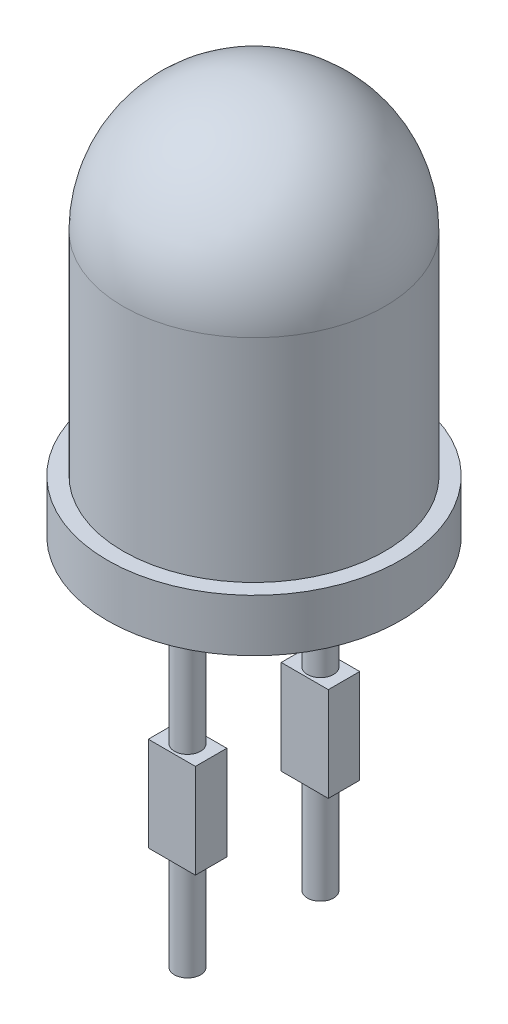
ISO-10303-21;
HEADER;
FILE_DESCRIPTION(('STEP AP214'),'2;1');
FILE_NAME('part.step','',(''),(''),'','','');
FILE_SCHEMA(('AUTOMOTIVE_DESIGN { 1 0 10303 214 1 1 1 1 }'));
ENDSEC;
DATA;
#1=APPLICATION_CONTEXT('core data for automotive mechanical design processes');
#2=APPLICATION_PROTOCOL_DEFINITION('international standard','automotive_design',2000,#1);
#3=PRODUCT_CONTEXT('',#1,'mechanical');
#4=PRODUCT('Part','Part','',(#3));
#5=PRODUCT_RELATED_PRODUCT_CATEGORY('part','',(#4));
#6=PRODUCT_DEFINITION_FORMATION('','',#4);
#7=PRODUCT_DEFINITION_CONTEXT('part definition',#1,'design');
#8=PRODUCT_DEFINITION('design','',#6,#7);
#9=PRODUCT_DEFINITION_SHAPE('','',#8);
#10=(LENGTH_UNIT() NAMED_UNIT(*) SI_UNIT(.MILLI.,.METRE.));
#11=(NAMED_UNIT(*) PLANE_ANGLE_UNIT() SI_UNIT($,.RADIAN.));
#12=(NAMED_UNIT(*) SI_UNIT($,.STERADIAN.) SOLID_ANGLE_UNIT());
#13=UNCERTAINTY_MEASURE_WITH_UNIT(LENGTH_MEASURE(1.E-05),#10,'distance_accuracy_value','');
#14=(GEOMETRIC_REPRESENTATION_CONTEXT(3) GLOBAL_UNCERTAINTY_ASSIGNED_CONTEXT((#13)) GLOBAL_UNIT_ASSIGNED_CONTEXT((#10,
#11,#12)) REPRESENTATION_CONTEXT('',''));
#15=CARTESIAN_POINT('',(0.,0.,0.));
#16=DIRECTION('',(0.,0.,1.));
#17=DIRECTION('',(1.,0.,0.));
#18=AXIS2_PLACEMENT_3D('',#15,#16,#17);
#19=CARTESIAN_POINT('',(0.,-14.025,-1.27));
#20=DIRECTION('',(0.,1.,0.));
#21=DIRECTION('',(0.,0.,1.));
#22=AXIS2_PLACEMENT_3D('',#19,#20,#21);
#23=CYLINDRICAL_SURFACE('',#22,0.25);
#24=CARTESIAN_POINT('',(0.,-3.025,-1.27));
#25=DIRECTION('',(0.,-1.,0.));
#26=DIRECTION('',(0.,0.,1.));
#27=AXIS2_PLACEMENT_3D('',#24,#25,#26);
#28=CIRCLE('',#27,0.25);
#29=CARTESIAN_POINT('',(0.,-3.025,-1.02));
#30=VERTEX_POINT('',#29);
#31=EDGE_CURVE('E128',#30,#30,#28,.T.);
#32=ORIENTED_EDGE('',*,*,#31,.T.);
#33=EDGE_LOOP('',(#32));
#34=FACE_BOUND('',#33,.T.);
#35=CARTESIAN_POINT('',(0.,-5.825,-1.27));
#36=DIRECTION('',(0.,-1.,0.));
#37=DIRECTION('',(0.,0.,-1.));
#38=AXIS2_PLACEMENT_3D('',#35,#36,#37);
#39=CIRCLE('',#38,0.25);
#40=CARTESIAN_POINT('',(0.,-5.825,-1.52));
#41=VERTEX_POINT('',#40);
#42=EDGE_CURVE('E12',#41,#41,#39,.T.);
#43=ORIENTED_EDGE('',*,*,#42,.F.);
#44=EDGE_LOOP('',(#43));
#45=FACE_BOUND('',#44,.T.);
#46=ADVANCED_FACE('F50',(#34,#45),#23,.T.);
#47=CARTESIAN_POINT('',(0.,-3.025,-1.27));
#48=DIRECTION('',(0.,1.,0.));
#49=DIRECTION('',(0.,0.,1.));
#50=AXIS2_PLACEMENT_3D('',#47,#48,#49);
#51=PLANE('',#50);
#52=ORIENTED_EDGE('',*,*,#31,.F.);
#53=EDGE_LOOP('',(#52));
#54=FACE_BOUND('',#53,.T.);
#55=ADVANCED_FACE('F52',(#54),#51,.T.);
#56=CARTESIAN_POINT('',(0.45,-5.825,-1.57));
#57=DIRECTION('',(0.,0.,1.));
#58=DIRECTION('',(0.,-1.,0.));
#59=AXIS2_PLACEMENT_3D('',#56,#57,#58);
#60=PLANE('',#59);
#61=DIRECTION('',(0.,1.,0.));
#62=VECTOR('',#61,1.);
#63=CARTESIAN_POINT('',(-0.45,-5.825,-1.57));
#64=LINE('',#63,#62);
#65=CARTESIAN_POINT('',(-0.45,-7.625,-1.57));
#66=VERTEX_POINT('',#65);
#67=CARTESIAN_POINT('',(-0.45,-5.825,-1.57));
#68=VERTEX_POINT('',#67);
#69=EDGE_CURVE('E119',#66,#68,#64,.T.);
#70=ORIENTED_EDGE('',*,*,#69,.T.);
#71=DIRECTION('',(-1.,0.,0.));
#72=VECTOR('',#71,1.);
#73=CARTESIAN_POINT('',(0.45,-5.825,-1.57));
#74=LINE('',#73,#72);
#75=CARTESIAN_POINT('',(0.45,-5.825,-1.57));
#76=VERTEX_POINT('',#75);
#77=EDGE_CURVE('E110',#76,#68,#74,.T.);
#78=ORIENTED_EDGE('',*,*,#77,.F.);
#79=DIRECTION('',(0.,1.,0.));
#80=VECTOR('',#79,1.);
#81=CARTESIAN_POINT('',(0.45,-5.825,-1.57));
#82=LINE('',#81,#80);
#83=CARTESIAN_POINT('',(0.45,-7.625,-1.57));
#84=VERTEX_POINT('',#83);
#85=EDGE_CURVE('E104',#84,#76,#82,.T.);
#86=ORIENTED_EDGE('',*,*,#85,.F.);
#87=DIRECTION('',(-1.,0.,0.));
#88=VECTOR('',#87,1.);
#89=CARTESIAN_POINT('',(0.45,-7.625,-1.57));
#90=LINE('',#89,#88);
#91=EDGE_CURVE('E115',#84,#66,#90,.T.);
#92=ORIENTED_EDGE('',*,*,#91,.T.);
#93=EDGE_LOOP('',(#70,#78,#86,#92));
#94=FACE_BOUND('',#93,.T.);
#95=ADVANCED_FACE('F156',(#94),#60,.F.);
#96=CARTESIAN_POINT('',(0.45,-5.825,-0.970000000000001));
#97=DIRECTION('',(0.,-1.,0.));
#98=DIRECTION('',(0.,0.,-1.));
#99=AXIS2_PLACEMENT_3D('',#96,#97,#98);
#100=PLANE('',#99);
#101=ORIENTED_EDGE('',*,*,#42,.T.);
#102=EDGE_LOOP('',(#101));
#103=FACE_BOUND('',#102,.T.);
#104=DIRECTION('',(0.,0.,1.));
#105=VECTOR('',#104,1.);
#106=CARTESIAN_POINT('',(-0.45,-5.825,-0.970000000000001));
#107=LINE('',#106,#105);
#108=CARTESIAN_POINT('',(-0.45,-5.825,-0.970000000000001));
#109=VERTEX_POINT('',#108);
#110=EDGE_CURVE('E109',#68,#109,#107,.T.);
#111=ORIENTED_EDGE('',*,*,#110,.T.);
#112=DIRECTION('',(-1.,0.,0.));
#113=VECTOR('',#112,1.);
#114=CARTESIAN_POINT('',(0.45,-5.825,-0.970000000000001));
#115=LINE('',#114,#113);
#116=CARTESIAN_POINT('',(0.45,-5.825,-0.970000000000001));
#117=VERTEX_POINT('',#116);
#118=EDGE_CURVE('E107',#117,#109,#115,.T.);
#119=ORIENTED_EDGE('',*,*,#118,.F.);
#120=DIRECTION('',(0.,0.,1.));
#121=VECTOR('',#120,1.);
#122=CARTESIAN_POINT('',(0.45,-5.825,-0.970000000000001));
#123=LINE('',#122,#121);
#124=EDGE_CURVE('E99',#76,#117,#123,.T.);
#125=ORIENTED_EDGE('',*,*,#124,.F.);
#126=ORIENTED_EDGE('',*,*,#77,.T.);
#127=EDGE_LOOP('',(#111,#119,#125,#126));
#128=FACE_BOUND('',#127,.T.);
#129=ADVANCED_FACE('F108',(#103,#128),#100,.F.);
#130=CARTESIAN_POINT('',(0.45,-5.825,-0.970000000000001));
#131=DIRECTION('',(0.,0.,-1.));
#132=DIRECTION('',(0.,1.,0.));
#133=AXIS2_PLACEMENT_3D('',#130,#131,#132);
#134=PLANE('',#133);
#135=DIRECTION('',(0.,-1.,0.));
#136=VECTOR('',#135,1.);
#137=CARTESIAN_POINT('',(-0.45,-5.825,-0.970000000000001));
#138=LINE('',#137,#136);
#139=CARTESIAN_POINT('',(-0.45,-7.625,-0.970000000000001));
#140=VERTEX_POINT('',#139);
#141=EDGE_CURVE('E85',#109,#140,#138,.T.);
#142=ORIENTED_EDGE('',*,*,#141,.T.);
#143=DIRECTION('',(-1.,0.,0.));
#144=VECTOR('',#143,1.);
#145=CARTESIAN_POINT('',(0.45,-7.625,-0.970000000000001));
#146=LINE('',#145,#144);
#147=CARTESIAN_POINT('',(0.45,-7.625,-0.970000000000001));
#148=VERTEX_POINT('',#147);
#149=EDGE_CURVE('E111',#148,#140,#146,.T.);
#150=ORIENTED_EDGE('',*,*,#149,.F.);
#151=DIRECTION('',(0.,-1.,0.));
#152=VECTOR('',#151,1.);
#153=CARTESIAN_POINT('',(0.45,-5.825,-0.970000000000001));
#154=LINE('',#153,#152);
#155=EDGE_CURVE('E102',#117,#148,#154,.T.);
#156=ORIENTED_EDGE('',*,*,#155,.F.);
#157=ORIENTED_EDGE('',*,*,#118,.T.);
#158=EDGE_LOOP('',(#142,#150,#156,#157));
#159=FACE_BOUND('',#158,.T.);
#160=ADVANCED_FACE('F113',(#159),#134,.F.);
#161=CARTESIAN_POINT('',(0.45,-7.625,-0.970000000000001));
#162=DIRECTION('',(0.,1.,0.));
#163=DIRECTION('',(0.,0.,1.));
#164=AXIS2_PLACEMENT_3D('',#161,#162,#163);
#165=PLANE('',#164);
#166=CARTESIAN_POINT('',(0.,-7.625,-1.27));
#167=DIRECTION('',(0.,1.,0.));
#168=DIRECTION('',(0.,0.,1.));
#169=AXIS2_PLACEMENT_3D('',#166,#167,#168);
#170=CIRCLE('',#169,0.25);
#171=CARTESIAN_POINT('',(0.,-7.625,-1.02));
#172=VERTEX_POINT('',#171);
#173=EDGE_CURVE('E60',#172,#172,#170,.T.);
#174=ORIENTED_EDGE('',*,*,#173,.T.);
#175=EDGE_LOOP('',(#174));
#176=FACE_BOUND('',#175,.T.);
#177=DIRECTION('',(0.,0.,-1.));
#178=VECTOR('',#177,1.);
#179=CARTESIAN_POINT('',(-0.45,-7.625,-0.970000000000001));
#180=LINE('',#179,#178);
#181=EDGE_CURVE('E91',#140,#66,#180,.T.);
#182=ORIENTED_EDGE('',*,*,#181,.T.);
#183=ORIENTED_EDGE('',*,*,#91,.F.);
#184=DIRECTION('',(0.,0.,-1.));
#185=VECTOR('',#184,1.);
#186=CARTESIAN_POINT('',(0.45,-7.625,-0.970000000000001));
#187=LINE('',#186,#185);
#188=EDGE_CURVE('E68',#148,#84,#187,.T.);
#189=ORIENTED_EDGE('',*,*,#188,.F.);
#190=ORIENTED_EDGE('',*,*,#149,.T.);
#191=EDGE_LOOP('',(#182,#183,#189,#190));
#192=FACE_BOUND('',#191,.T.);
#193=ADVANCED_FACE('F134',(#176,#192),#165,.F.);
#194=CARTESIAN_POINT('',(0.45,0.,0.));
#195=DIRECTION('',(1.,0.,0.));
#196=DIRECTION('',(0.,0.,-1.));
#197=AXIS2_PLACEMENT_3D('',#194,#195,#196);
#198=PLANE('',#197);
#199=ORIENTED_EDGE('',*,*,#85,.T.);
#200=ORIENTED_EDGE('',*,*,#124,.T.);
#201=ORIENTED_EDGE('',*,*,#155,.T.);
#202=ORIENTED_EDGE('',*,*,#188,.T.);
#203=EDGE_LOOP('',(#199,#200,#201,#202));
#204=FACE_BOUND('',#203,.T.);
#205=ADVANCED_FACE('F100',(#204),#198,.T.);
#206=CARTESIAN_POINT('',(-0.45,0.,0.));
#207=DIRECTION('',(1.,0.,0.));
#208=DIRECTION('',(0.,0.,-1.));
#209=AXIS2_PLACEMENT_3D('',#206,#207,#208);
#210=PLANE('',#209);
#211=ORIENTED_EDGE('',*,*,#69,.F.);
#212=ORIENTED_EDGE('',*,*,#181,.F.);
#213=ORIENTED_EDGE('',*,*,#141,.F.);
#214=ORIENTED_EDGE('',*,*,#110,.F.);
#215=EDGE_LOOP('',(#211,#212,#213,#214));
#216=FACE_BOUND('',#215,.T.);
#217=ADVANCED_FACE('F139',(#216),#210,.F.);
#218=CARTESIAN_POINT('',(0.,-9.525,-1.27));
#219=DIRECTION('',(0.,1.,0.));
#220=DIRECTION('',(0.,0.,1.));
#221=AXIS2_PLACEMENT_3D('',#218,#219,#220);
#222=CIRCLE('',#221,0.25);
#223=CARTESIAN_POINT('',(0.,-9.525,-1.02));
#224=VERTEX_POINT('',#223);
#225=EDGE_CURVE('E54',#224,#224,#222,.T.);
#226=ORIENTED_EDGE('',*,*,#225,.T.);
#227=EDGE_LOOP('',(#226));
#228=FACE_BOUND('',#227,.T.);
#229=ORIENTED_EDGE('',*,*,#173,.F.);
#230=EDGE_LOOP('',(#229));
#231=FACE_BOUND('',#230,.T.);
#232=ADVANCED_FACE('F136',(#228,#231),#23,.T.);
#233=CARTESIAN_POINT('',(-2.8,-9.525,2.14522286923373));
#234=DIRECTION('',(0.,1.,0.));
#235=DIRECTION('',(0.,0.,1.));
#236=AXIS2_PLACEMENT_3D('',#233,#234,#235);
#237=PLANE('',#236);
#238=ORIENTED_EDGE('',*,*,#225,.F.);
#239=EDGE_LOOP('',(#238));
#240=FACE_BOUND('',#239,.T.);
#241=ADVANCED_FACE('F138',(#240),#237,.F.);
#242=CLOSED_SHELL('',(#46,#55,#95,#129,#160,#193,#205,#217,#232,#241));
#243=MANIFOLD_SOLID_BREP('B2',#242);
#244=CARTESIAN_POINT('',(0.,-14.025,1.27));
#245=DIRECTION('',(0.,1.,0.));
#246=DIRECTION('',(0.,0.,1.));
#247=AXIS2_PLACEMENT_3D('',#244,#245,#246);
#248=CYLINDRICAL_SURFACE('',#247,0.25);
#249=CARTESIAN_POINT('',(0.,-3.025,1.27));
#250=DIRECTION('',(0.,-1.,0.));
#251=DIRECTION('',(0.,0.,-1.));
#252=AXIS2_PLACEMENT_3D('',#249,#250,#251);
#253=CIRCLE('',#252,0.25);
#254=CARTESIAN_POINT('',(0.,-3.025,1.02));
#255=VERTEX_POINT('',#254);
#256=EDGE_CURVE('E330',#255,#255,#253,.T.);
#257=ORIENTED_EDGE('',*,*,#256,.T.);
#258=EDGE_LOOP('',(#257));
#259=FACE_BOUND('',#258,.T.);
#260=CARTESIAN_POINT('',(0.,-5.825,1.27));
#261=DIRECTION('',(0.,-1.,0.));
#262=DIRECTION('',(0.,0.,-1.));
#263=AXIS2_PLACEMENT_3D('',#260,#261,#262);
#264=CIRCLE('',#263,0.25);
#265=CARTESIAN_POINT('',(0.,-5.825,1.02));
#266=VERTEX_POINT('',#265);
#267=EDGE_CURVE('E48',#266,#266,#264,.T.);
#268=ORIENTED_EDGE('',*,*,#267,.F.);
#269=EDGE_LOOP('',(#268));
#270=FACE_BOUND('',#269,.T.);
#271=ADVANCED_FACE('F260',(#259,#270),#248,.T.);
#272=CARTESIAN_POINT('',(0.,-3.025,1.27));
#273=DIRECTION('',(0.,-1.,0.));
#274=DIRECTION('',(0.,0.,-1.));
#275=AXIS2_PLACEMENT_3D('',#272,#273,#274);
#276=PLANE('',#275);
#277=ORIENTED_EDGE('',*,*,#256,.F.);
#278=EDGE_LOOP('',(#277));
#279=FACE_BOUND('',#278,.T.);
#280=ADVANCED_FACE('F355',(#279),#276,.F.);
#281=CARTESIAN_POINT('',(0.45,-5.825,0.970000000000001));
#282=DIRECTION('',(0.,0.,1.));
#283=DIRECTION('',(0.,-1.,0.));
#284=AXIS2_PLACEMENT_3D('',#281,#282,#283);
#285=PLANE('',#284);
#286=DIRECTION('',(0.,1.,0.));
#287=VECTOR('',#286,1.);
#288=CARTESIAN_POINT('',(-0.45,-5.825,0.970000000000001));
#289=LINE('',#288,#287);
#290=CARTESIAN_POINT('',(-0.45,-7.625,0.970000000000001));
#291=VERTEX_POINT('',#290);
#292=CARTESIAN_POINT('',(-0.45,-5.825,0.970000000000001));
#293=VERTEX_POINT('',#292);
#294=EDGE_CURVE('E322',#291,#293,#289,.T.);
#295=ORIENTED_EDGE('',*,*,#294,.T.);
#296=DIRECTION('',(-1.,0.,0.));
#297=VECTOR('',#296,1.);
#298=CARTESIAN_POINT('',(0.45,-5.825,0.970000000000001));
#299=LINE('',#298,#297);
#300=CARTESIAN_POINT('',(0.45,-5.825,0.970000000000001));
#301=VERTEX_POINT('',#300);
#302=EDGE_CURVE('E370',#301,#293,#299,.T.);
#303=ORIENTED_EDGE('',*,*,#302,.F.);
#304=DIRECTION('',(0.,1.,0.));
#305=VECTOR('',#304,1.);
#306=CARTESIAN_POINT('',(0.45,-5.825,0.970000000000001));
#307=LINE('',#306,#305);
#308=CARTESIAN_POINT('',(0.45,-7.625,0.970000000000001));
#309=VERTEX_POINT('',#308);
#310=EDGE_CURVE('E323',#309,#301,#307,.T.);
#311=ORIENTED_EDGE('',*,*,#310,.F.);
#312=DIRECTION('',(-1.,0.,0.));
#313=VECTOR('',#312,1.);
#314=CARTESIAN_POINT('',(0.45,-7.625,0.970000000000001));
#315=LINE('',#314,#313);
#316=EDGE_CURVE('E318',#309,#291,#315,.T.);
#317=ORIENTED_EDGE('',*,*,#316,.T.);
#318=EDGE_LOOP('',(#295,#303,#311,#317));
#319=FACE_BOUND('',#318,.T.);
#320=ADVANCED_FACE('F360',(#319),#285,.F.);
#321=CARTESIAN_POINT('',(0.45,-5.825,0.970000000000001));
#322=DIRECTION('',(0.,-1.,0.));
#323=DIRECTION('',(0.,0.,-1.));
#324=AXIS2_PLACEMENT_3D('',#321,#322,#323);
#325=PLANE('',#324);
#326=ORIENTED_EDGE('',*,*,#267,.T.);
#327=EDGE_LOOP('',(#326));
#328=FACE_BOUND('',#327,.T.);
#329=DIRECTION('',(0.,0.,1.));
#330=VECTOR('',#329,1.);
#331=CARTESIAN_POINT('',(-0.45,-5.825,0.970000000000001));
#332=LINE('',#331,#330);
#333=CARTESIAN_POINT('',(-0.45,-5.825,1.57));
#334=VERTEX_POINT('',#333);
#335=EDGE_CURVE('E277',#293,#334,#332,.T.);
#336=ORIENTED_EDGE('',*,*,#335,.T.);
#337=DIRECTION('',(-1.,0.,0.));
#338=VECTOR('',#337,1.);
#339=CARTESIAN_POINT('',(0.45,-5.825,1.57));
#340=LINE('',#339,#338);
#341=CARTESIAN_POINT('',(0.45,-5.825,1.57));
#342=VERTEX_POINT('',#341);
#343=EDGE_CURVE('E314',#342,#334,#340,.T.);
#344=ORIENTED_EDGE('',*,*,#343,.F.);
#345=DIRECTION('',(0.,0.,1.));
#346=VECTOR('',#345,1.);
#347=CARTESIAN_POINT('',(0.45,-5.825,0.970000000000001));
#348=LINE('',#347,#346);
#349=EDGE_CURVE('E293',#301,#342,#348,.T.);
#350=ORIENTED_EDGE('',*,*,#349,.F.);
#351=ORIENTED_EDGE('',*,*,#302,.T.);
#352=EDGE_LOOP('',(#336,#344,#350,#351));
#353=FACE_BOUND('',#352,.T.);
#354=ADVANCED_FACE('F366',(#328,#353),#325,.F.);
#355=CARTESIAN_POINT('',(0.45,-5.825,1.57));
#356=DIRECTION('',(0.,0.,-1.));
#357=DIRECTION('',(0.,1.,0.));
#358=AXIS2_PLACEMENT_3D('',#355,#356,#357);
#359=PLANE('',#358);
#360=DIRECTION('',(0.,-1.,0.));
#361=VECTOR('',#360,1.);
#362=CARTESIAN_POINT('',(-0.45,-5.825,1.57));
#363=LINE('',#362,#361);
#364=CARTESIAN_POINT('',(-0.45,-7.625,1.57));
#365=VERTEX_POINT('',#364);
#366=EDGE_CURVE('E309',#334,#365,#363,.T.);
#367=ORIENTED_EDGE('',*,*,#366,.T.);
#368=DIRECTION('',(-1.,0.,0.));
#369=VECTOR('',#368,1.);
#370=CARTESIAN_POINT('',(0.45,-7.625,1.57));
#371=LINE('',#370,#369);
#372=CARTESIAN_POINT('',(0.45,-7.625,1.57));
#373=VERTEX_POINT('',#372);
#374=EDGE_CURVE('E312',#373,#365,#371,.T.);
#375=ORIENTED_EDGE('',*,*,#374,.F.);
#376=DIRECTION('',(0.,-1.,0.));
#377=VECTOR('',#376,1.);
#378=CARTESIAN_POINT('',(0.45,-5.825,1.57));
#379=LINE('',#378,#377);
#380=EDGE_CURVE('E332',#342,#373,#379,.T.);
#381=ORIENTED_EDGE('',*,*,#380,.F.);
#382=ORIENTED_EDGE('',*,*,#343,.T.);
#383=EDGE_LOOP('',(#367,#375,#381,#382));
#384=FACE_BOUND('',#383,.T.);
#385=ADVANCED_FACE('F310',(#384),#359,.F.);
#386=CARTESIAN_POINT('',(0.45,-7.625,0.970000000000001));
#387=DIRECTION('',(0.,1.,0.));
#388=DIRECTION('',(0.,0.,1.));
#389=AXIS2_PLACEMENT_3D('',#386,#387,#388);
#390=PLANE('',#389);
#391=CARTESIAN_POINT('',(0.,-7.625,1.27));
#392=DIRECTION('',(0.,1.,0.));
#393=DIRECTION('',(0.,0.,1.));
#394=AXIS2_PLACEMENT_3D('',#391,#392,#393);
#395=CIRCLE('',#394,0.25);
#396=CARTESIAN_POINT('',(0.,-7.625,1.52));
#397=VERTEX_POINT('',#396);
#398=EDGE_CURVE('E269',#397,#397,#395,.T.);
#399=ORIENTED_EDGE('',*,*,#398,.T.);
#400=EDGE_LOOP('',(#399));
#401=FACE_BOUND('',#400,.T.);
#402=DIRECTION('',(0.,0.,-1.));
#403=VECTOR('',#402,1.);
#404=CARTESIAN_POINT('',(-0.45,-7.625,0.970000000000001));
#405=LINE('',#404,#403);
#406=EDGE_CURVE('E303',#365,#291,#405,.T.);
#407=ORIENTED_EDGE('',*,*,#406,.T.);
#408=ORIENTED_EDGE('',*,*,#316,.F.);
#409=DIRECTION('',(0.,0.,-1.));
#410=VECTOR('',#409,1.);
#411=CARTESIAN_POINT('',(0.45,-7.625,0.970000000000001));
#412=LINE('',#411,#410);
#413=EDGE_CURVE('E317',#373,#309,#412,.T.);
#414=ORIENTED_EDGE('',*,*,#413,.F.);
#415=ORIENTED_EDGE('',*,*,#374,.T.);
#416=EDGE_LOOP('',(#407,#408,#414,#415));
#417=FACE_BOUND('',#416,.T.);
#418=ADVANCED_FACE('F316',(#401,#417),#390,.F.);
#419=CARTESIAN_POINT('',(0.45,0.,0.));
#420=DIRECTION('',(-1.,0.,0.));
#421=DIRECTION('',(0.,0.,1.));
#422=AXIS2_PLACEMENT_3D('',#419,#420,#421);
#423=PLANE('',#422);
#424=ORIENTED_EDGE('',*,*,#310,.T.);
#425=ORIENTED_EDGE('',*,*,#349,.T.);
#426=ORIENTED_EDGE('',*,*,#380,.T.);
#427=ORIENTED_EDGE('',*,*,#413,.T.);
#428=EDGE_LOOP('',(#424,#425,#426,#427));
#429=FACE_BOUND('',#428,.T.);
#430=ADVANCED_FACE('F351',(#429),#423,.F.);
#431=CARTESIAN_POINT('',(-0.45,0.,0.));
#432=DIRECTION('',(-1.,0.,0.));
#433=DIRECTION('',(0.,0.,1.));
#434=AXIS2_PLACEMENT_3D('',#431,#432,#433);
#435=PLANE('',#434);
#436=ORIENTED_EDGE('',*,*,#294,.F.);
#437=ORIENTED_EDGE('',*,*,#406,.F.);
#438=ORIENTED_EDGE('',*,*,#366,.F.);
#439=ORIENTED_EDGE('',*,*,#335,.F.);
#440=EDGE_LOOP('',(#436,#437,#438,#439));
#441=FACE_BOUND('',#440,.T.);
#442=ADVANCED_FACE('F320',(#441),#435,.T.);
#443=CARTESIAN_POINT('',(0.,-9.525,1.27));
#444=DIRECTION('',(0.,1.,0.));
#445=DIRECTION('',(0.,0.,1.));
#446=AXIS2_PLACEMENT_3D('',#443,#444,#445);
#447=CIRCLE('',#446,0.25);
#448=CARTESIAN_POINT('',(0.,-9.525,1.52));
#449=VERTEX_POINT('',#448);
#450=EDGE_CURVE('E263',#449,#449,#447,.T.);
#451=ORIENTED_EDGE('',*,*,#450,.T.);
#452=EDGE_LOOP('',(#451));
#453=FACE_BOUND('',#452,.T.);
#454=ORIENTED_EDGE('',*,*,#398,.F.);
#455=EDGE_LOOP('',(#454));
#456=FACE_BOUND('',#455,.T.);
#457=ADVANCED_FACE('F341',(#453,#456),#248,.T.);
#458=CARTESIAN_POINT('',(-2.8,-9.525,2.14522286923373));
#459=DIRECTION('',(0.,1.,0.));
#460=DIRECTION('',(0.,0.,1.));
#461=AXIS2_PLACEMENT_3D('',#458,#459,#460);
#462=PLANE('',#461);
#463=ORIENTED_EDGE('',*,*,#450,.F.);
#464=EDGE_LOOP('',(#463));
#465=FACE_BOUND('',#464,.T.);
#466=ADVANCED_FACE('F343',(#465),#462,.F.);
#467=CLOSED_SHELL('',(#271,#280,#320,#354,#385,#418,#430,#442,#457,#466));
#468=MANIFOLD_SOLID_BREP('B6',#467);
#469=CARTESIAN_POINT('',(0.,2.025,0.));
#470=DIRECTION('',(0.,1.,0.));
#471=DIRECTION('',(0.,0.,1.));
#472=AXIS2_PLACEMENT_3D('',#469,#470,#471);
#473=SPHERICAL_SURFACE('',#472,2.5);
#474=CARTESIAN_POINT('',(0.,2.025,0.));
#475=DIRECTION('',(0.,1.,0.));
#476=DIRECTION('',(0.,0.,1.));
#477=AXIS2_PLACEMENT_3D('',#474,#475,#476);
#478=CIRCLE('',#477,2.5);
#479=CARTESIAN_POINT('',(0.,2.025,2.5));
#480=VERTEX_POINT('',#479);
#481=EDGE_CURVE('E477',#480,#480,#478,.T.);
#482=ORIENTED_EDGE('',*,*,#481,.T.);
#483=EDGE_LOOP('',(#482));
#484=FACE_BOUND('',#483,.T.);
#485=ADVANCED_FACE('F463',(#484),#473,.T.);
#486=CARTESIAN_POINT('',(0.,-3.025,2.8));
#487=DIRECTION('',(0.,-1.,0.));
#488=DIRECTION('',(0.,0.,-1.));
#489=AXIS2_PLACEMENT_3D('',#486,#487,#488);
#490=PLANE('',#489);
#491=CARTESIAN_POINT('',(0.,-3.025,0.));
#492=DIRECTION('',(0.,1.,0.));
#493=DIRECTION('',(0.,0.,1.));
#494=AXIS2_PLACEMENT_3D('',#491,#492,#493);
#495=CIRCLE('',#494,2.8);
#496=CARTESIAN_POINT('',(0.,-3.025,2.8));
#497=VERTEX_POINT('',#496);
#498=EDGE_CURVE('E259',#497,#497,#495,.T.);
#499=ORIENTED_EDGE('',*,*,#498,.F.);
#500=EDGE_LOOP('',(#499));
#501=FACE_BOUND('',#500,.T.);
#502=ADVANCED_FACE('F495',(#501),#490,.T.);
#503=CARTESIAN_POINT('',(0.,4.525,0.));
#504=DIRECTION('',(0.,1.,0.));
#505=DIRECTION('',(0.,0.,1.));
#506=AXIS2_PLACEMENT_3D('',#503,#504,#505);
#507=CYLINDRICAL_SURFACE('',#506,2.8);
#508=ORIENTED_EDGE('',*,*,#498,.T.);
#509=EDGE_LOOP('',(#508));
#510=FACE_BOUND('',#509,.T.);
#511=CARTESIAN_POINT('',(0.,-2.025,0.));
#512=DIRECTION('',(0.,1.,0.));
#513=DIRECTION('',(0.,0.,1.));
#514=AXIS2_PLACEMENT_3D('',#511,#512,#513);
#515=CIRCLE('',#514,2.8);
#516=CARTESIAN_POINT('',(0.,-2.025,2.8));
#517=VERTEX_POINT('',#516);
#518=EDGE_CURVE('E469',#517,#517,#515,.T.);
#519=ORIENTED_EDGE('',*,*,#518,.F.);
#520=EDGE_LOOP('',(#519));
#521=FACE_BOUND('',#520,.T.);
#522=ADVANCED_FACE('F492',(#510,#521),#507,.T.);
#523=CARTESIAN_POINT('',(0.,-2.025,2.5));
#524=DIRECTION('',(0.,1.,0.));
#525=DIRECTION('',(0.,0.,1.));
#526=AXIS2_PLACEMENT_3D('',#523,#524,#525);
#527=PLANE('',#526);
#528=ORIENTED_EDGE('',*,*,#518,.T.);
#529=EDGE_LOOP('',(#528));
#530=FACE_BOUND('',#529,.T.);
#531=CARTESIAN_POINT('',(0.,-2.025,0.));
#532=DIRECTION('',(0.,1.,0.));
#533=DIRECTION('',(0.,0.,1.));
#534=AXIS2_PLACEMENT_3D('',#531,#532,#533);
#535=CIRCLE('',#534,2.5);
#536=CARTESIAN_POINT('',(0.,-2.025,2.5));
#537=VERTEX_POINT('',#536);
#538=EDGE_CURVE('E473',#537,#537,#535,.T.);
#539=ORIENTED_EDGE('',*,*,#538,.F.);
#540=EDGE_LOOP('',(#539));
#541=FACE_BOUND('',#540,.T.);
#542=ADVANCED_FACE('F486',(#530,#541),#527,.T.);
#543=CARTESIAN_POINT('',(0.,4.525,0.));
#544=DIRECTION('',(0.,1.,0.));
#545=DIRECTION('',(0.,0.,1.));
#546=AXIS2_PLACEMENT_3D('',#543,#544,#545);
#547=CYLINDRICAL_SURFACE('',#546,2.5);
#548=ORIENTED_EDGE('',*,*,#538,.T.);
#549=EDGE_LOOP('',(#548));
#550=FACE_BOUND('',#549,.T.);
#551=ORIENTED_EDGE('',*,*,#481,.F.);
#552=EDGE_LOOP('',(#551));
#553=FACE_BOUND('',#552,.T.);
#554=ADVANCED_FACE('F484',(#550,#553),#547,.T.);
#555=CLOSED_SHELL('',(#485,#502,#522,#542,#554));
#556=MANIFOLD_SOLID_BREP('B42',#555);
#557=ADVANCED_BREP_SHAPE_REPRESENTATION('',(#18,#243,#468,#556),#14);
#558=SHAPE_DEFINITION_REPRESENTATION(#9,#557);
ENDSEC;
END-ISO-10303-21;
